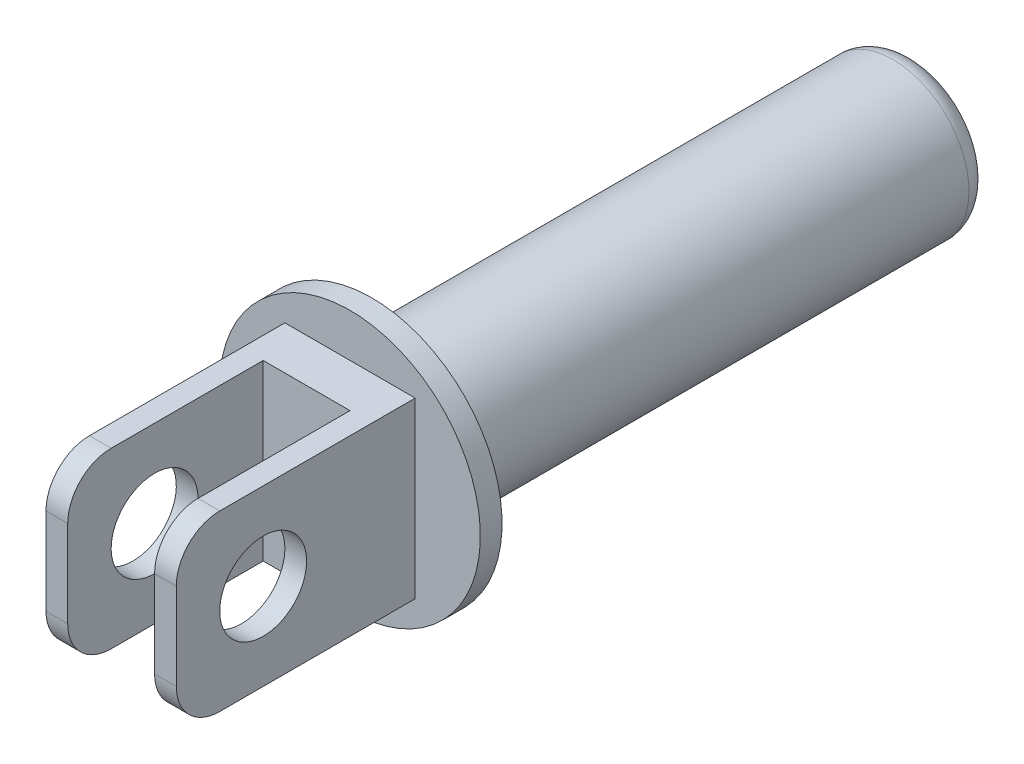
ISO-10303-21;
HEADER;
FILE_DESCRIPTION(('STEP AP214'),'2;1');
FILE_NAME('part.step','',(''),(''),'','','');
FILE_SCHEMA(('AUTOMOTIVE_DESIGN { 1 0 10303 214 1 1 1 1 }'));
ENDSEC;
DATA;
#1=APPLICATION_CONTEXT('core data for automotive mechanical design processes');
#2=APPLICATION_PROTOCOL_DEFINITION('international standard','automotive_design',2000,#1);
#3=PRODUCT_CONTEXT('',#1,'mechanical');
#4=PRODUCT('Part','Part','',(#3));
#5=PRODUCT_RELATED_PRODUCT_CATEGORY('part','',(#4));
#6=PRODUCT_DEFINITION_FORMATION('','',#4);
#7=PRODUCT_DEFINITION_CONTEXT('part definition',#1,'design');
#8=PRODUCT_DEFINITION('design','',#6,#7);
#9=PRODUCT_DEFINITION_SHAPE('','',#8);
#10=(LENGTH_UNIT() NAMED_UNIT(*) SI_UNIT(.MILLI.,.METRE.));
#11=(NAMED_UNIT(*) PLANE_ANGLE_UNIT() SI_UNIT($,.RADIAN.));
#12=(NAMED_UNIT(*) SI_UNIT($,.STERADIAN.) SOLID_ANGLE_UNIT());
#13=UNCERTAINTY_MEASURE_WITH_UNIT(LENGTH_MEASURE(1.E-05),#10,'distance_accuracy_value','');
#14=(GEOMETRIC_REPRESENTATION_CONTEXT(3) GLOBAL_UNCERTAINTY_ASSIGNED_CONTEXT((#13)) GLOBAL_UNIT_ASSIGNED_CONTEXT((#10,
#11,#12)) REPRESENTATION_CONTEXT('',''));
#15=CARTESIAN_POINT('',(0.,0.,0.));
#16=DIRECTION('',(0.,0.,1.));
#17=DIRECTION('',(1.,0.,0.));
#18=AXIS2_PLACEMENT_3D('',#15,#16,#17);
#19=CARTESIAN_POINT('',(0.,0.,30.));
#20=DIRECTION('',(0.,0.,1.));
#21=DIRECTION('',(-1.,0.,0.));
#22=AXIS2_PLACEMENT_3D('',#19,#20,#21);
#23=PLANE('',#22);
#24=DIRECTION('',(0.,1.,0.));
#25=VECTOR('',#24,1.);
#26=CARTESIAN_POINT('',(-7.5,10.,30.));
#27=LINE('',#26,#25);
#28=CARTESIAN_POINT('',(-7.5,-5.,30.));
#29=VERTEX_POINT('',#28);
#30=CARTESIAN_POINT('',(-7.5,5.,30.));
#31=VERTEX_POINT('',#30);
#32=EDGE_CURVE('E178',#29,#31,#27,.T.);
#33=ORIENTED_EDGE('',*,*,#32,.F.);
#34=DIRECTION('',(-1.,0.,0.));
#35=VECTOR('',#34,1.);
#36=CARTESIAN_POINT('',(-7.5,-5.,30.));
#37=LINE('',#36,#35);
#38=CARTESIAN_POINT('',(-5.,-5.,30.));
#39=VERTEX_POINT('',#38);
#40=EDGE_CURVE('E246',#39,#29,#37,.T.);
#41=ORIENTED_EDGE('',*,*,#40,.F.);
#42=DIRECTION('',(0.,1.,0.));
#43=VECTOR('',#42,1.);
#44=CARTESIAN_POINT('',(-5.,-10.,30.));
#45=LINE('',#44,#43);
#46=CARTESIAN_POINT('',(-5.,5.,30.));
#47=VERTEX_POINT('',#46);
#48=EDGE_CURVE('E153',#39,#47,#45,.T.);
#49=ORIENTED_EDGE('',*,*,#48,.T.);
#50=DIRECTION('',(1.,0.,0.));
#51=VECTOR('',#50,1.);
#52=CARTESIAN_POINT('',(-5.,5.,30.));
#53=LINE('',#52,#51);
#54=EDGE_CURVE('E248',#31,#47,#53,.T.);
#55=ORIENTED_EDGE('',*,*,#54,.F.);
#56=EDGE_LOOP('',(#33,#41,#49,#55));
#57=FACE_BOUND('',#56,.T.);
#58=ADVANCED_FACE('F37',(#57),#23,.T.);
#59=CARTESIAN_POINT('',(0.,0.,2.5));
#60=DIRECTION('',(0.,0.,1.));
#61=DIRECTION('',(-1.,0.,0.));
#62=AXIS2_PLACEMENT_3D('',#59,#60,#61);
#63=PLANE('',#62);
#64=CARTESIAN_POINT('',(0.,0.,2.5));
#65=DIRECTION('',(0.,0.,-1.));
#66=DIRECTION('',(-1.,0.,0.));
#67=AXIS2_PLACEMENT_3D('',#64,#65,#66);
#68=CIRCLE('',#67,15.);
#69=CARTESIAN_POINT('',(-15.,0.,2.5));
#70=VERTEX_POINT('',#69);
#71=EDGE_CURVE('E203',#70,#70,#68,.T.);
#72=ORIENTED_EDGE('',*,*,#71,.F.);
#73=EDGE_LOOP('',(#72));
#74=FACE_BOUND('',#73,.T.);
#75=DIRECTION('',(1.,0.,0.));
#76=VECTOR('',#75,1.);
#77=CARTESIAN_POINT('',(7.5,10.,2.5));
#78=LINE('',#77,#76);
#79=CARTESIAN_POINT('',(-7.5,10.,2.5));
#80=VERTEX_POINT('',#79);
#81=CARTESIAN_POINT('',(7.5,10.,2.5));
#82=VERTEX_POINT('',#81);
#83=EDGE_CURVE('E187',#80,#82,#78,.T.);
#84=ORIENTED_EDGE('',*,*,#83,.T.);
#85=DIRECTION('',(0.,-1.,0.));
#86=VECTOR('',#85,1.);
#87=CARTESIAN_POINT('',(7.5,10.,2.5));
#88=LINE('',#87,#86);
#89=CARTESIAN_POINT('',(7.5,-10.,2.5));
#90=VERTEX_POINT('',#89);
#91=EDGE_CURVE('E190',#82,#90,#88,.T.);
#92=ORIENTED_EDGE('',*,*,#91,.T.);
#93=DIRECTION('',(-1.,0.,0.));
#94=VECTOR('',#93,1.);
#95=CARTESIAN_POINT('',(7.5,-10.,2.5));
#96=LINE('',#95,#94);
#97=CARTESIAN_POINT('',(-7.5,-10.,2.5));
#98=VERTEX_POINT('',#97);
#99=EDGE_CURVE('E181',#90,#98,#96,.T.);
#100=ORIENTED_EDGE('',*,*,#99,.T.);
#101=DIRECTION('',(0.,1.,0.));
#102=VECTOR('',#101,1.);
#103=CARTESIAN_POINT('',(-7.5,10.,2.5));
#104=LINE('',#103,#102);
#105=EDGE_CURVE('E175',#98,#80,#104,.T.);
#106=ORIENTED_EDGE('',*,*,#105,.T.);
#107=EDGE_LOOP('',(#84,#92,#100,#106));
#108=FACE_BOUND('',#107,.T.);
#109=ADVANCED_FACE('F272',(#74,#108),#63,.T.);
#110=CARTESIAN_POINT('',(0.,0.,-62.5));
#111=DIRECTION('',(0.,0.,1.));
#112=DIRECTION('',(-1.,0.,0.));
#113=AXIS2_PLACEMENT_3D('',#110,#111,#112);
#114=CYLINDRICAL_SURFACE('',#113,8.75);
#115=CARTESIAN_POINT('',(0.,0.,-60.));
#116=DIRECTION('',(0.,0.,1.));
#117=DIRECTION('',(1.,0.,0.));
#118=AXIS2_PLACEMENT_3D('',#115,#116,#117);
#119=CIRCLE('',#118,8.75);
#120=CARTESIAN_POINT('',(8.75,0.,-60.));
#121=VERTEX_POINT('',#120);
#122=EDGE_CURVE('E221',#121,#121,#119,.F.);
#123=ORIENTED_EDGE('',*,*,#122,.F.);
#124=EDGE_LOOP('',(#123));
#125=FACE_BOUND('',#124,.T.);
#126=CARTESIAN_POINT('',(0.,0.,-2.5));
#127=DIRECTION('',(0.,0.,-1.));
#128=DIRECTION('',(-1.,0.,0.));
#129=AXIS2_PLACEMENT_3D('',#126,#127,#128);
#130=CIRCLE('',#129,8.75);
#131=CARTESIAN_POINT('',(-8.75,0.,-2.5));
#132=VERTEX_POINT('',#131);
#133=EDGE_CURVE('E215',#132,#132,#130,.F.);
#134=ORIENTED_EDGE('',*,*,#133,.F.);
#135=EDGE_LOOP('',(#134));
#136=FACE_BOUND('',#135,.T.);
#137=ADVANCED_FACE('F300',(#125,#136),#114,.T.);
#138=CARTESIAN_POINT('',(0.,0.,-62.5));
#139=DIRECTION('',(0.,0.,-1.));
#140=DIRECTION('',(1.,0.,0.));
#141=AXIS2_PLACEMENT_3D('',#138,#139,#140);
#142=PLANE('',#141);
#143=CARTESIAN_POINT('',(0.,0.,-62.5));
#144=DIRECTION('',(0.,0.,1.));
#145=DIRECTION('',(1.,0.,0.));
#146=AXIS2_PLACEMENT_3D('',#143,#144,#145);
#147=CIRCLE('',#146,6.25);
#148=CARTESIAN_POINT('',(6.25,0.,-62.5));
#149=VERTEX_POINT('',#148);
#150=EDGE_CURVE('E218',#149,#149,#147,.T.);
#151=ORIENTED_EDGE('',*,*,#150,.F.);
#152=EDGE_LOOP('',(#151));
#153=FACE_BOUND('',#152,.T.);
#154=CARTESIAN_POINT('',(0.,0.,-62.5));
#155=DIRECTION('',(0.,0.,1.));
#156=DIRECTION('',(1.,0.,0.));
#157=AXIS2_PLACEMENT_3D('',#154,#155,#156);
#158=CIRCLE('',#157,3.75);
#159=CARTESIAN_POINT('',(3.75,0.,-62.5));
#160=VERTEX_POINT('',#159);
#161=EDGE_CURVE('E167',#160,#160,#158,.T.);
#162=ORIENTED_EDGE('',*,*,#161,.T.);
#163=EDGE_LOOP('',(#162));
#164=FACE_BOUND('',#163,.T.);
#165=ADVANCED_FACE('F328',(#153,#164),#142,.T.);
#166=CARTESIAN_POINT('',(0.,0.,0.));
#167=DIRECTION('',(0.,0.,1.));
#168=DIRECTION('',(-1.,0.,0.));
#169=AXIS2_PLACEMENT_3D('',#166,#167,#168);
#170=PLANE('',#169);
#171=CARTESIAN_POINT('',(0.,0.,0.));
#172=DIRECTION('',(0.,0.,-1.));
#173=DIRECTION('',(-1.,0.,0.));
#174=AXIS2_PLACEMENT_3D('',#171,#172,#173);
#175=CIRCLE('',#174,11.25);
#176=CARTESIAN_POINT('',(-11.25,0.,0.));
#177=VERTEX_POINT('',#176);
#178=EDGE_CURVE('E206',#177,#177,#175,.T.);
#179=ORIENTED_EDGE('',*,*,#178,.F.);
#180=EDGE_LOOP('',(#179));
#181=FACE_BOUND('',#180,.T.);
#182=CARTESIAN_POINT('',(0.,0.,0.));
#183=DIRECTION('',(0.,0.,-1.));
#184=DIRECTION('',(-1.,0.,0.));
#185=AXIS2_PLACEMENT_3D('',#182,#183,#184);
#186=CIRCLE('',#185,15.);
#187=CARTESIAN_POINT('',(-15.,0.,0.));
#188=VERTEX_POINT('',#187);
#189=EDGE_CURVE('E202',#188,#188,#186,.T.);
#190=ORIENTED_EDGE('',*,*,#189,.T.);
#191=EDGE_LOOP('',(#190));
#192=FACE_BOUND('',#191,.T.);
#193=ADVANCED_FACE('F325',(#181,#192),#170,.F.);
#194=CARTESIAN_POINT('',(0.,0.,2.5));
#195=DIRECTION('',(0.,0.,-1.));
#196=DIRECTION('',(1.,0.,0.));
#197=AXIS2_PLACEMENT_3D('',#194,#195,#196);
#198=CYLINDRICAL_SURFACE('',#197,15.);
#199=ORIENTED_EDGE('',*,*,#71,.T.);
#200=EDGE_LOOP('',(#199));
#201=FACE_BOUND('',#200,.T.);
#202=ORIENTED_EDGE('',*,*,#189,.F.);
#203=EDGE_LOOP('',(#202));
#204=FACE_BOUND('',#203,.T.);
#205=ADVANCED_FACE('F322',(#201,#204),#198,.T.);
#206=CARTESIAN_POINT('',(-7.5,10.,30.));
#207=DIRECTION('',(1.,0.,0.));
#208=DIRECTION('',(0.,1.,0.));
#209=AXIS2_PLACEMENT_3D('',#206,#207,#208);
#210=PLANE('',#209);
#211=CARTESIAN_POINT('',(-7.5,0.,20.));
#212=DIRECTION('',(-1.,0.,0.));
#213=DIRECTION('',(0.,1.,0.));
#214=AXIS2_PLACEMENT_3D('',#211,#212,#213);
#215=CIRCLE('',#214,5.);
#216=CARTESIAN_POINT('',(-7.5,5.,20.));
#217=VERTEX_POINT('',#216);
#218=EDGE_CURVE('E159',#217,#217,#215,.T.);
#219=ORIENTED_EDGE('',*,*,#218,.F.);
#220=EDGE_LOOP('',(#219));
#221=FACE_BOUND('',#220,.T.);
#222=DIRECTION('',(0.,0.,-1.));
#223=VECTOR('',#222,1.);
#224=CARTESIAN_POINT('',(-7.5,10.,30.));
#225=LINE('',#224,#223);
#226=CARTESIAN_POINT('',(-7.5,10.,25.));
#227=VERTEX_POINT('',#226);
#228=EDGE_CURVE('E200',#227,#80,#225,.T.);
#229=ORIENTED_EDGE('',*,*,#228,.T.);
#230=ORIENTED_EDGE('',*,*,#105,.F.);
#231=DIRECTION('',(0.,0.,-1.));
#232=VECTOR('',#231,1.);
#233=CARTESIAN_POINT('',(-7.5,-10.,30.));
#234=LINE('',#233,#232);
#235=CARTESIAN_POINT('',(-7.5,-10.,25.));
#236=VERTEX_POINT('',#235);
#237=EDGE_CURVE('E184',#236,#98,#234,.T.);
#238=ORIENTED_EDGE('',*,*,#237,.F.);
#239=CARTESIAN_POINT('',(-7.5,-5.,25.));
#240=DIRECTION('',(-1.,0.,0.));
#241=DIRECTION('',(0.,1.,0.));
#242=AXIS2_PLACEMENT_3D('',#239,#240,#241);
#243=CIRCLE('',#242,5.);
#244=EDGE_CURVE('E45',#29,#236,#243,.F.);
#245=ORIENTED_EDGE('',*,*,#244,.F.);
#246=ORIENTED_EDGE('',*,*,#32,.T.);
#247=CARTESIAN_POINT('',(-7.5,5.,25.));
#248=DIRECTION('',(-1.,0.,0.));
#249=DIRECTION('',(0.,1.,0.));
#250=AXIS2_PLACEMENT_3D('',#247,#248,#249);
#251=CIRCLE('',#250,5.);
#252=EDGE_CURVE('E11',#227,#31,#251,.F.);
#253=ORIENTED_EDGE('',*,*,#252,.F.);
#254=EDGE_LOOP('',(#229,#230,#238,#245,#246,#253));
#255=FACE_BOUND('',#254,.T.);
#256=ADVANCED_FACE('F257',(#221,#255),#210,.F.);
#257=CARTESIAN_POINT('',(7.5,10.,30.));
#258=DIRECTION('',(0.,-1.,0.));
#259=DIRECTION('',(0.,0.,1.));
#260=AXIS2_PLACEMENT_3D('',#257,#258,#259);
#261=PLANE('',#260);
#262=DIRECTION('',(0.,0.,-1.));
#263=VECTOR('',#262,1.);
#264=CARTESIAN_POINT('',(7.5,10.,30.));
#265=LINE('',#264,#263);
#266=CARTESIAN_POINT('',(7.5,10.,25.));
#267=VERTEX_POINT('',#266);
#268=EDGE_CURVE('E198',#267,#82,#265,.T.);
#269=ORIENTED_EDGE('',*,*,#268,.T.);
#270=ORIENTED_EDGE('',*,*,#83,.F.);
#271=ORIENTED_EDGE('',*,*,#228,.F.);
#272=DIRECTION('',(1.,0.,0.));
#273=VECTOR('',#272,1.);
#274=CARTESIAN_POINT('',(-7.5,10.,25.));
#275=LINE('',#274,#273);
#276=CARTESIAN_POINT('',(-5.,10.,25.));
#277=VERTEX_POINT('',#276);
#278=EDGE_CURVE('E242',#277,#227,#275,.F.);
#279=ORIENTED_EDGE('',*,*,#278,.F.);
#280=DIRECTION('',(0.,0.,1.));
#281=VECTOR('',#280,1.);
#282=CARTESIAN_POINT('',(-5.,10.,7.5));
#283=LINE('',#282,#281);
#284=CARTESIAN_POINT('',(-5.,10.,7.5));
#285=VERTEX_POINT('',#284);
#286=EDGE_CURVE('E152',#285,#277,#283,.T.);
#287=ORIENTED_EDGE('',*,*,#286,.F.);
#288=DIRECTION('',(1.,0.,0.));
#289=VECTOR('',#288,1.);
#290=CARTESIAN_POINT('',(-5.,10.,7.5));
#291=LINE('',#290,#289);
#292=CARTESIAN_POINT('',(5.,10.,7.5));
#293=VERTEX_POINT('',#292);
#294=EDGE_CURVE('E130',#285,#293,#291,.T.);
#295=ORIENTED_EDGE('',*,*,#294,.T.);
#296=DIRECTION('',(0.,0.,1.));
#297=VECTOR('',#296,1.);
#298=CARTESIAN_POINT('',(5.,10.,7.5));
#299=LINE('',#298,#297);
#300=CARTESIAN_POINT('',(5.,10.,25.));
#301=VERTEX_POINT('',#300);
#302=EDGE_CURVE('E139',#293,#301,#299,.T.);
#303=ORIENTED_EDGE('',*,*,#302,.T.);
#304=DIRECTION('',(1.,0.,0.));
#305=VECTOR('',#304,1.);
#306=CARTESIAN_POINT('',(5.,10.,25.));
#307=LINE('',#306,#305);
#308=EDGE_CURVE('E244',#267,#301,#307,.F.);
#309=ORIENTED_EDGE('',*,*,#308,.F.);
#310=EDGE_LOOP('',(#269,#270,#271,#279,#287,#295,#303,#309));
#311=FACE_BOUND('',#310,.T.);
#312=ADVANCED_FACE('F149',(#311),#261,.F.);
#313=CARTESIAN_POINT('',(7.5,10.,30.));
#314=DIRECTION('',(-1.,0.,0.));
#315=DIRECTION('',(0.,-1.,0.));
#316=AXIS2_PLACEMENT_3D('',#313,#314,#315);
#317=PLANE('',#316);
#318=CARTESIAN_POINT('',(7.5,0.,20.));
#319=DIRECTION('',(1.,0.,0.));
#320=DIRECTION('',(0.,-1.,0.));
#321=AXIS2_PLACEMENT_3D('',#318,#319,#320);
#322=CIRCLE('',#321,5.);
#323=CARTESIAN_POINT('',(7.5,5.,20.));
#324=VERTEX_POINT('',#323);
#325=EDGE_CURVE('E509',#324,#324,#322,.T.);
#326=ORIENTED_EDGE('',*,*,#325,.F.);
#327=EDGE_LOOP('',(#326));
#328=FACE_BOUND('',#327,.T.);
#329=DIRECTION('',(0.,0.,-1.));
#330=VECTOR('',#329,1.);
#331=CARTESIAN_POINT('',(7.5,-10.,30.));
#332=LINE('',#331,#330);
#333=CARTESIAN_POINT('',(7.5,-10.,25.));
#334=VERTEX_POINT('',#333);
#335=EDGE_CURVE('E196',#334,#90,#332,.T.);
#336=ORIENTED_EDGE('',*,*,#335,.T.);
#337=ORIENTED_EDGE('',*,*,#91,.F.);
#338=ORIENTED_EDGE('',*,*,#268,.F.);
#339=CARTESIAN_POINT('',(7.5,5.,25.));
#340=DIRECTION('',(1.,0.,0.));
#341=DIRECTION('',(0.,-1.,0.));
#342=AXIS2_PLACEMENT_3D('',#339,#340,#341);
#343=CIRCLE('',#342,5.);
#344=CARTESIAN_POINT('',(7.5,5.,30.));
#345=VERTEX_POINT('',#344);
#346=EDGE_CURVE('E237',#345,#267,#343,.F.);
#347=ORIENTED_EDGE('',*,*,#346,.F.);
#348=DIRECTION('',(0.,-1.,0.));
#349=VECTOR('',#348,1.);
#350=CARTESIAN_POINT('',(7.5,10.,30.));
#351=LINE('',#350,#349);
#352=CARTESIAN_POINT('',(7.5,-5.,30.));
#353=VERTEX_POINT('',#352);
#354=EDGE_CURVE('E180',#345,#353,#351,.T.);
#355=ORIENTED_EDGE('',*,*,#354,.T.);
#356=CARTESIAN_POINT('',(7.5,-5.,25.));
#357=DIRECTION('',(1.,0.,0.));
#358=DIRECTION('',(0.,-1.,0.));
#359=AXIS2_PLACEMENT_3D('',#356,#357,#358);
#360=CIRCLE('',#359,5.);
#361=EDGE_CURVE('E239',#334,#353,#360,.F.);
#362=ORIENTED_EDGE('',*,*,#361,.F.);
#363=EDGE_LOOP('',(#336,#337,#338,#347,#355,#362));
#364=FACE_BOUND('',#363,.T.);
#365=ADVANCED_FACE('F274',(#328,#364),#317,.F.);
#366=CARTESIAN_POINT('',(7.5,-10.,30.));
#367=DIRECTION('',(0.,1.,0.));
#368=DIRECTION('',(0.,0.,-1.));
#369=AXIS2_PLACEMENT_3D('',#366,#367,#368);
#370=PLANE('',#369);
#371=DIRECTION('',(0.,0.,1.));
#372=VECTOR('',#371,1.);
#373=CARTESIAN_POINT('',(5.,-10.,7.5));
#374=LINE('',#373,#372);
#375=CARTESIAN_POINT('',(5.,-10.,7.5));
#376=VERTEX_POINT('',#375);
#377=CARTESIAN_POINT('',(5.,-10.,25.));
#378=VERTEX_POINT('',#377);
#379=EDGE_CURVE('E146',#376,#378,#374,.T.);
#380=ORIENTED_EDGE('',*,*,#379,.F.);
#381=DIRECTION('',(-1.,0.,0.));
#382=VECTOR('',#381,1.);
#383=CARTESIAN_POINT('',(5.,-10.,7.5));
#384=LINE('',#383,#382);
#385=CARTESIAN_POINT('',(-5.,-10.,7.5));
#386=VERTEX_POINT('',#385);
#387=EDGE_CURVE('E133',#376,#386,#384,.T.);
#388=ORIENTED_EDGE('',*,*,#387,.T.);
#389=DIRECTION('',(0.,0.,1.));
#390=VECTOR('',#389,1.);
#391=CARTESIAN_POINT('',(-5.,-10.,7.5));
#392=LINE('',#391,#390);
#393=CARTESIAN_POINT('',(-5.,-10.,25.));
#394=VERTEX_POINT('',#393);
#395=EDGE_CURVE('E168',#386,#394,#392,.T.);
#396=ORIENTED_EDGE('',*,*,#395,.T.);
#397=DIRECTION('',(-1.,0.,0.));
#398=VECTOR('',#397,1.);
#399=CARTESIAN_POINT('',(-5.,-10.,25.));
#400=LINE('',#399,#398);
#401=EDGE_CURVE('E232',#236,#394,#400,.F.);
#402=ORIENTED_EDGE('',*,*,#401,.F.);
#403=ORIENTED_EDGE('',*,*,#237,.T.);
#404=ORIENTED_EDGE('',*,*,#99,.F.);
#405=ORIENTED_EDGE('',*,*,#335,.F.);
#406=DIRECTION('',(-1.,0.,0.));
#407=VECTOR('',#406,1.);
#408=CARTESIAN_POINT('',(7.5,-10.,25.));
#409=LINE('',#408,#407);
#410=EDGE_CURVE('E235',#378,#334,#409,.F.);
#411=ORIENTED_EDGE('',*,*,#410,.F.);
#412=EDGE_LOOP('',(#380,#388,#396,#402,#403,#404,#405,#411));
#413=FACE_BOUND('',#412,.T.);
#414=ADVANCED_FACE('F260',(#413),#370,.F.);
#415=ORIENTED_EDGE('',*,*,#354,.F.);
#416=DIRECTION('',(1.,0.,0.));
#417=VECTOR('',#416,1.);
#418=CARTESIAN_POINT('',(7.5,5.,30.));
#419=LINE('',#418,#417);
#420=CARTESIAN_POINT('',(5.,5.,30.));
#421=VERTEX_POINT('',#420);
#422=EDGE_CURVE('E224',#421,#345,#419,.T.);
#423=ORIENTED_EDGE('',*,*,#422,.F.);
#424=DIRECTION('',(0.,-1.,0.));
#425=VECTOR('',#424,1.);
#426=CARTESIAN_POINT('',(5.,10.,30.));
#427=LINE('',#426,#425);
#428=CARTESIAN_POINT('',(5.,-5.,30.));
#429=VERTEX_POINT('',#428);
#430=EDGE_CURVE('E156',#421,#429,#427,.T.);
#431=ORIENTED_EDGE('',*,*,#430,.T.);
#432=DIRECTION('',(-1.,0.,0.));
#433=VECTOR('',#432,1.);
#434=CARTESIAN_POINT('',(5.,-5.,30.));
#435=LINE('',#434,#433);
#436=EDGE_CURVE('E226',#353,#429,#435,.T.);
#437=ORIENTED_EDGE('',*,*,#436,.F.);
#438=EDGE_LOOP('',(#415,#423,#431,#437));
#439=FACE_BOUND('',#438,.T.);
#440=ADVANCED_FACE('F283',(#439),#23,.T.);
#441=CARTESIAN_POINT('',(0.,0.,-27.5));
#442=DIRECTION('',(0.,0.,-1.));
#443=DIRECTION('',(1.,0.,0.));
#444=AXIS2_PLACEMENT_3D('',#441,#442,#443);
#445=CYLINDRICAL_SURFACE('',#444,3.75);
#446=CARTESIAN_POINT('',(0.,0.,-27.5));
#447=DIRECTION('',(0.,0.,1.));
#448=DIRECTION('',(1.,0.,0.));
#449=AXIS2_PLACEMENT_3D('',#446,#447,#448);
#450=CIRCLE('',#449,3.75);
#451=CARTESIAN_POINT('',(3.75,0.,-27.5));
#452=VERTEX_POINT('',#451);
#453=EDGE_CURVE('E172',#452,#452,#450,.T.);
#454=ORIENTED_EDGE('',*,*,#453,.T.);
#455=EDGE_LOOP('',(#454));
#456=FACE_BOUND('',#455,.T.);
#457=ORIENTED_EDGE('',*,*,#161,.F.);
#458=EDGE_LOOP('',(#457));
#459=FACE_BOUND('',#458,.T.);
#460=ADVANCED_FACE('F306',(#456,#459),#445,.F.);
#461=CARTESIAN_POINT('',(0.,0.,-27.5));
#462=DIRECTION('',(0.,0.,-1.));
#463=DIRECTION('',(1.,0.,0.));
#464=AXIS2_PLACEMENT_3D('',#461,#462,#463);
#465=PLANE('',#464);
#466=ORIENTED_EDGE('',*,*,#453,.F.);
#467=EDGE_LOOP('',(#466));
#468=FACE_BOUND('',#467,.T.);
#469=ADVANCED_FACE('F311',(#468),#465,.T.);
#470=CARTESIAN_POINT('',(-5.,-10.,7.5));
#471=DIRECTION('',(-1.,0.,0.));
#472=DIRECTION('',(0.,0.,-1.));
#473=AXIS2_PLACEMENT_3D('',#470,#471,#472);
#474=PLANE('',#473);
#475=CARTESIAN_POINT('',(-5.,0.,20.));
#476=DIRECTION('',(1.,0.,0.));
#477=DIRECTION('',(0.,0.,-1.));
#478=AXIS2_PLACEMENT_3D('',#475,#476,#477);
#479=CIRCLE('',#478,5.);
#480=CARTESIAN_POINT('',(-5.,5.,20.));
#481=VERTEX_POINT('',#480);
#482=EDGE_CURVE('E212',#481,#481,#479,.T.);
#483=ORIENTED_EDGE('',*,*,#482,.F.);
#484=EDGE_LOOP('',(#483));
#485=FACE_BOUND('',#484,.T.);
#486=ORIENTED_EDGE('',*,*,#48,.F.);
#487=CARTESIAN_POINT('',(-5.,-5.,25.));
#488=DIRECTION('',(1.,0.,0.));
#489=DIRECTION('',(0.,0.,-1.));
#490=AXIS2_PLACEMENT_3D('',#487,#488,#489);
#491=CIRCLE('',#490,5.);
#492=EDGE_CURVE('E250',#394,#39,#491,.F.);
#493=ORIENTED_EDGE('',*,*,#492,.F.);
#494=ORIENTED_EDGE('',*,*,#395,.F.);
#495=DIRECTION('',(0.,1.,0.));
#496=VECTOR('',#495,1.);
#497=CARTESIAN_POINT('',(-5.,-10.,7.5));
#498=LINE('',#497,#496);
#499=EDGE_CURVE('E147',#386,#285,#498,.T.);
#500=ORIENTED_EDGE('',*,*,#499,.T.);
#501=ORIENTED_EDGE('',*,*,#286,.T.);
#502=CARTESIAN_POINT('',(-5.,5.,25.));
#503=DIRECTION('',(1.,0.,0.));
#504=DIRECTION('',(0.,0.,-1.));
#505=AXIS2_PLACEMENT_3D('',#502,#503,#504);
#506=CIRCLE('',#505,5.);
#507=EDGE_CURVE('E252',#47,#277,#506,.F.);
#508=ORIENTED_EDGE('',*,*,#507,.F.);
#509=EDGE_LOOP('',(#486,#493,#494,#500,#501,#508));
#510=FACE_BOUND('',#509,.T.);
#511=ADVANCED_FACE('F265',(#485,#510),#474,.F.);
#512=CARTESIAN_POINT('',(5.,10.,7.5));
#513=DIRECTION('',(1.,0.,0.));
#514=DIRECTION('',(0.,1.,0.));
#515=AXIS2_PLACEMENT_3D('',#512,#513,#514);
#516=PLANE('',#515);
#517=CARTESIAN_POINT('',(5.,0.,20.));
#518=DIRECTION('',(-1.,0.,0.));
#519=DIRECTION('',(0.,1.,0.));
#520=AXIS2_PLACEMENT_3D('',#517,#518,#519);
#521=CIRCLE('',#520,5.);
#522=CARTESIAN_POINT('',(5.,5.,20.));
#523=VERTEX_POINT('',#522);
#524=EDGE_CURVE('E209',#523,#523,#521,.T.);
#525=ORIENTED_EDGE('',*,*,#524,.F.);
#526=EDGE_LOOP('',(#525));
#527=FACE_BOUND('',#526,.T.);
#528=ORIENTED_EDGE('',*,*,#430,.F.);
#529=CARTESIAN_POINT('',(5.,5.,25.));
#530=DIRECTION('',(-1.,0.,0.));
#531=DIRECTION('',(0.,1.,0.));
#532=AXIS2_PLACEMENT_3D('',#529,#530,#531);
#533=CIRCLE('',#532,5.);
#534=EDGE_CURVE('E142',#301,#421,#533,.F.);
#535=ORIENTED_EDGE('',*,*,#534,.F.);
#536=ORIENTED_EDGE('',*,*,#302,.F.);
#537=DIRECTION('',(0.,-1.,0.));
#538=VECTOR('',#537,1.);
#539=CARTESIAN_POINT('',(5.,10.,7.5));
#540=LINE('',#539,#538);
#541=EDGE_CURVE('E126',#293,#376,#540,.T.);
#542=ORIENTED_EDGE('',*,*,#541,.T.);
#543=ORIENTED_EDGE('',*,*,#379,.T.);
#544=CARTESIAN_POINT('',(5.,-5.,25.));
#545=DIRECTION('',(-1.,0.,0.));
#546=DIRECTION('',(0.,1.,0.));
#547=AXIS2_PLACEMENT_3D('',#544,#545,#546);
#548=CIRCLE('',#547,5.);
#549=EDGE_CURVE('E230',#429,#378,#548,.F.);
#550=ORIENTED_EDGE('',*,*,#549,.F.);
#551=EDGE_LOOP('',(#528,#535,#536,#542,#543,#550));
#552=FACE_BOUND('',#551,.T.);
#553=ADVANCED_FACE('F141',(#527,#552),#516,.F.);
#554=CARTESIAN_POINT('',(0.,0.,7.5));
#555=DIRECTION('',(0.,0.,1.));
#556=DIRECTION('',(-1.,0.,0.));
#557=AXIS2_PLACEMENT_3D('',#554,#555,#556);
#558=PLANE('',#557);
#559=ORIENTED_EDGE('',*,*,#294,.F.);
#560=ORIENTED_EDGE('',*,*,#499,.F.);
#561=ORIENTED_EDGE('',*,*,#387,.F.);
#562=ORIENTED_EDGE('',*,*,#541,.F.);
#563=EDGE_LOOP('',(#559,#560,#561,#562));
#564=FACE_BOUND('',#563,.T.);
#565=ADVANCED_FACE('F128',(#564),#558,.T.);
#566=CARTESIAN_POINT('',(-15.,0.,20.));
#567=DIRECTION('',(1.,0.,0.));
#568=DIRECTION('',(0.,1.,0.));
#569=AXIS2_PLACEMENT_3D('',#566,#567,#568);
#570=CYLINDRICAL_SURFACE('',#569,5.);
#571=CARTESIAN_POINT('',(5.,5.,20.));
#572=CARTESIAN_POINT('',(5.02604166666667,5.,20.));
#573=CARTESIAN_POINT('',(5.05208333333333,5.,20.));
#574=CARTESIAN_POINT('',(5.10416666666667,5.,20.));
#575=CARTESIAN_POINT('',(5.13020833333333,5.,20.));
#576=CARTESIAN_POINT('',(5.18229166666667,5.,20.));
#577=CARTESIAN_POINT('',(5.20833333333334,5.,20.));
#578=CARTESIAN_POINT('',(5.26041666666667,5.,20.));
#579=CARTESIAN_POINT('',(5.28645833333333,5.,20.));
#580=CARTESIAN_POINT('',(5.33854166666667,5.,20.));
#581=CARTESIAN_POINT('',(5.36458333333333,5.,20.));
#582=CARTESIAN_POINT('',(5.41666666666667,5.,20.));
#583=CARTESIAN_POINT('',(5.44270833333333,5.,20.));
#584=CARTESIAN_POINT('',(5.49479166666667,5.,20.));
#585=CARTESIAN_POINT('',(5.52083333333334,5.,20.));
#586=CARTESIAN_POINT('',(5.57291666666667,5.,20.));
#587=CARTESIAN_POINT('',(5.59895833333333,5.,20.));
#588=CARTESIAN_POINT('',(5.65104166666667,5.,20.));
#589=CARTESIAN_POINT('',(5.67708333333333,5.,20.));
#590=CARTESIAN_POINT('',(5.72916666666667,5.,20.));
#591=CARTESIAN_POINT('',(5.75520833333333,5.,20.));
#592=CARTESIAN_POINT('',(5.80729166666667,5.,20.));
#593=CARTESIAN_POINT('',(5.83333333333334,5.,20.));
#594=CARTESIAN_POINT('',(5.88541666666667,5.,20.));
#595=CARTESIAN_POINT('',(5.91145833333334,5.,20.));
#596=CARTESIAN_POINT('',(5.96354166666667,5.,20.));
#597=CARTESIAN_POINT('',(5.98958333333333,5.,20.));
#598=CARTESIAN_POINT('',(6.04166666666667,5.,20.));
#599=CARTESIAN_POINT('',(6.06770833333333,5.,20.));
#600=CARTESIAN_POINT('',(6.11979166666667,5.,20.));
#601=CARTESIAN_POINT('',(6.14583333333334,5.,20.));
#602=CARTESIAN_POINT('',(6.19791666666667,5.,20.));
#603=CARTESIAN_POINT('',(6.22395833333334,5.,20.));
#604=CARTESIAN_POINT('',(6.27604166666667,5.,20.));
#605=CARTESIAN_POINT('',(6.30208333333333,5.,20.));
#606=CARTESIAN_POINT('',(6.35416666666667,5.,20.));
#607=CARTESIAN_POINT('',(6.38020833333333,5.,20.));
#608=CARTESIAN_POINT('',(6.43229166666667,5.,20.));
#609=CARTESIAN_POINT('',(6.45833333333334,5.,20.));
#610=CARTESIAN_POINT('',(6.51041666666667,5.,20.));
#611=CARTESIAN_POINT('',(6.53645833333334,5.,20.));
#612=CARTESIAN_POINT('',(6.58854166666667,5.,20.));
#613=CARTESIAN_POINT('',(6.61458333333333,5.,20.));
#614=CARTESIAN_POINT('',(6.66666666666667,5.,20.));
#615=CARTESIAN_POINT('',(6.69270833333333,5.,20.));
#616=CARTESIAN_POINT('',(6.74479166666667,5.,20.));
#617=CARTESIAN_POINT('',(6.77083333333334,5.,20.));
#618=CARTESIAN_POINT('',(6.82291666666667,5.,20.));
#619=CARTESIAN_POINT('',(6.84895833333334,5.,20.));
#620=CARTESIAN_POINT('',(6.90104166666667,5.,20.));
#621=CARTESIAN_POINT('',(6.92708333333333,5.,20.));
#622=CARTESIAN_POINT('',(6.97916666666667,5.,20.));
#623=CARTESIAN_POINT('',(7.00520833333334,5.,20.));
#624=CARTESIAN_POINT('',(7.05729166666667,5.,20.));
#625=CARTESIAN_POINT('',(7.08333333333334,5.,20.));
#626=CARTESIAN_POINT('',(7.13541666666667,5.,20.));
#627=CARTESIAN_POINT('',(7.16145833333334,5.,20.));
#628=CARTESIAN_POINT('',(7.21354166666667,5.,20.));
#629=CARTESIAN_POINT('',(7.23958333333333,5.,20.));
#630=CARTESIAN_POINT('',(7.29166666666667,5.,20.));
#631=CARTESIAN_POINT('',(7.31770833333334,5.,20.));
#632=CARTESIAN_POINT('',(7.36979166666667,5.,20.));
#633=CARTESIAN_POINT('',(7.39583333333334,5.,20.));
#634=CARTESIAN_POINT('',(7.44791666666667,5.,20.));
#635=CARTESIAN_POINT('',(7.47395833333334,5.,20.));
#636=CARTESIAN_POINT('',(7.5,5.,20.));
#637=B_SPLINE_CURVE_WITH_KNOTS('',3,(#571,#572,#573,#574,#575,#576,#577,#578,#579,#580,#581,
#582,#583,#584,#585,#586,#587,#588,#589,#590,#591,#592,#593,#594,#595,#596,#597,#598,#599,#600,
#601,#602,#603,#604,#605,#606,#607,#608,#609,#610,#611,#612,#613,#614,#615,#616,#617,#618,#619,
#620,#621,#622,#623,#624,#625,#626,#627,#628,#629,#630,#631,#632,#633,#634,#635,#636),
.UNSPECIFIED.,.F.,.F.,(4,2,2,2,2,2,2,2,2,2,2,2,2,2,2,2,2,2,2,2,2,2,2,2,2,2,2,2,2,2,2,2,4),(0.,
0.0781249999999983,0.15625,0.234375000000002,0.3125,0.390624999999999,0.46875,0.546875000000002,
0.625000000000001,0.703124999999999,0.781250000000001,0.859375000000002,0.937500000000001,
1.015625,1.09375,1.171875,1.25,1.328125,1.40625,1.484375,1.5625,1.640625,1.71875,1.796875,1.875,
1.953125,2.03125,2.109375,2.1875,2.265625,2.34375,2.421875,2.5),.UNSPECIFIED.);
#638=EDGE_CURVE('BSEAM459',#523,#324,#637,.T.);
#639=ORIENTED_EDGE('',*,*,#524,.T.);
#640=ORIENTED_EDGE('',*,*,#325,.T.);
#641=ORIENTED_EDGE('',*,*,#638,.T.);
#642=ORIENTED_EDGE('',*,*,#638,.F.);
#643=EDGE_LOOP('',(#639,#641,#640,#642));
#644=FACE_BOUND('',#643,.T.);
#645=ADVANCED_FACE('F459',(#644),#570,.F.);
#646=CARTESIAN_POINT('',(-5.,5.,20.));
#647=CARTESIAN_POINT('',(-5.02604166666667,5.,20.));
#648=CARTESIAN_POINT('',(-5.05208333333334,5.,20.));
#649=CARTESIAN_POINT('',(-5.10416666666667,5.,20.));
#650=CARTESIAN_POINT('',(-5.13020833333334,5.,20.));
#651=CARTESIAN_POINT('',(-5.18229166666667,5.,20.));
#652=CARTESIAN_POINT('',(-5.20833333333334,5.,20.));
#653=CARTESIAN_POINT('',(-5.26041666666667,5.,20.));
#654=CARTESIAN_POINT('',(-5.28645833333334,5.,20.));
#655=CARTESIAN_POINT('',(-5.33854166666667,5.,20.));
#656=CARTESIAN_POINT('',(-5.36458333333334,5.,20.));
#657=CARTESIAN_POINT('',(-5.41666666666667,5.,20.));
#658=CARTESIAN_POINT('',(-5.44270833333333,5.,20.));
#659=CARTESIAN_POINT('',(-5.49479166666667,5.,20.));
#660=CARTESIAN_POINT('',(-5.52083333333333,5.,20.));
#661=CARTESIAN_POINT('',(-5.57291666666667,5.,20.));
#662=CARTESIAN_POINT('',(-5.59895833333333,5.,20.));
#663=CARTESIAN_POINT('',(-5.65104166666667,5.,20.));
#664=CARTESIAN_POINT('',(-5.67708333333333,5.,20.));
#665=CARTESIAN_POINT('',(-5.72916666666667,5.,20.));
#666=CARTESIAN_POINT('',(-5.75520833333334,5.,20.));
#667=CARTESIAN_POINT('',(-5.80729166666667,5.,20.));
#668=CARTESIAN_POINT('',(-5.83333333333334,5.,20.));
#669=CARTESIAN_POINT('',(-5.88541666666667,5.,20.));
#670=CARTESIAN_POINT('',(-5.91145833333334,5.,20.));
#671=CARTESIAN_POINT('',(-5.96354166666667,5.,20.));
#672=CARTESIAN_POINT('',(-5.98958333333334,5.,20.));
#673=CARTESIAN_POINT('',(-6.04166666666667,5.,20.));
#674=CARTESIAN_POINT('',(-6.06770833333334,5.,20.));
#675=CARTESIAN_POINT('',(-6.11979166666667,5.,20.));
#676=CARTESIAN_POINT('',(-6.14583333333334,5.,20.));
#677=CARTESIAN_POINT('',(-6.19791666666667,5.,20.));
#678=CARTESIAN_POINT('',(-6.22395833333333,5.,20.));
#679=CARTESIAN_POINT('',(-6.27604166666667,5.,20.));
#680=CARTESIAN_POINT('',(-6.30208333333333,5.,20.));
#681=CARTESIAN_POINT('',(-6.35416666666667,5.,20.));
#682=CARTESIAN_POINT('',(-6.38020833333333,5.,20.));
#683=CARTESIAN_POINT('',(-6.43229166666667,5.,20.));
#684=CARTESIAN_POINT('',(-6.45833333333333,5.,20.));
#685=CARTESIAN_POINT('',(-6.51041666666667,5.,20.));
#686=CARTESIAN_POINT('',(-6.53645833333333,5.,20.));
#687=CARTESIAN_POINT('',(-6.58854166666667,5.,20.));
#688=CARTESIAN_POINT('',(-6.61458333333333,5.,20.));
#689=CARTESIAN_POINT('',(-6.66666666666667,5.,20.));
#690=CARTESIAN_POINT('',(-6.69270833333333,5.,20.));
#691=CARTESIAN_POINT('',(-6.74479166666667,5.,20.));
#692=CARTESIAN_POINT('',(-6.77083333333333,5.,20.));
#693=CARTESIAN_POINT('',(-6.82291666666667,5.,20.));
#694=CARTESIAN_POINT('',(-6.84895833333333,5.,20.));
#695=CARTESIAN_POINT('',(-6.90104166666667,5.,20.));
#696=CARTESIAN_POINT('',(-6.92708333333333,5.,20.));
#697=CARTESIAN_POINT('',(-6.97916666666667,5.,20.));
#698=CARTESIAN_POINT('',(-7.00520833333333,5.,20.));
#699=CARTESIAN_POINT('',(-7.05729166666667,5.,20.));
#700=CARTESIAN_POINT('',(-7.08333333333333,5.,20.));
#701=CARTESIAN_POINT('',(-7.13541666666667,5.,20.));
#702=CARTESIAN_POINT('',(-7.16145833333333,5.,20.));
#703=CARTESIAN_POINT('',(-7.21354166666667,5.,20.));
#704=CARTESIAN_POINT('',(-7.23958333333333,5.,20.));
#705=CARTESIAN_POINT('',(-7.29166666666667,5.,20.));
#706=CARTESIAN_POINT('',(-7.31770833333333,5.,20.));
#707=CARTESIAN_POINT('',(-7.36979166666667,5.,20.));
#708=CARTESIAN_POINT('',(-7.39583333333333,5.,20.));
#709=CARTESIAN_POINT('',(-7.44791666666667,5.,20.));
#710=CARTESIAN_POINT('',(-7.47395833333333,5.,20.));
#711=CARTESIAN_POINT('',(-7.5,5.,20.));
#712=B_SPLINE_CURVE_WITH_KNOTS('',3,(#646,#647,#648,#649,#650,#651,#652,#653,#654,#655,#656,
#657,#658,#659,#660,#661,#662,#663,#664,#665,#666,#667,#668,#669,#670,#671,#672,#673,#674,#675,
#676,#677,#678,#679,#680,#681,#682,#683,#684,#685,#686,#687,#688,#689,#690,#691,#692,#693,#694,
#695,#696,#697,#698,#699,#700,#701,#702,#703,#704,#705,#706,#707,#708,#709,#710,#711),
.UNSPECIFIED.,.F.,.F.,(4,2,2,2,2,2,2,2,2,2,2,2,2,2,2,2,2,2,2,2,2,2,2,2,2,2,2,2,2,2,2,2,4),(0.,
0.0781250000000001,0.15625,0.234375,0.3125,0.390625,0.468749999999999,0.546874999999999,
0.624999999999999,0.703124999999999,0.781249999999999,0.859374999999999,0.937499999999999,
1.015625,1.09375,1.171875,1.25,1.328125,1.40625,1.484375,1.5625,1.640625,1.71875,1.796875,1.875,
1.953125,2.03125,2.109375,2.1875,2.265625,2.34375,2.421875,2.5),.UNSPECIFIED.);
#713=EDGE_CURVE('BSEAM342',#481,#217,#712,.T.);
#714=ORIENTED_EDGE('',*,*,#482,.T.);
#715=ORIENTED_EDGE('',*,*,#218,.T.);
#716=ORIENTED_EDGE('',*,*,#713,.T.);
#717=ORIENTED_EDGE('',*,*,#713,.F.);
#718=EDGE_LOOP('',(#714,#716,#715,#717));
#719=FACE_BOUND('',#718,.T.);
#720=ADVANCED_FACE('F342',(#719),#570,.F.);
#721=CARTESIAN_POINT('',(0.,0.,-2.5));
#722=DIRECTION('',(0.,0.,1.));
#723=DIRECTION('',(-1.,0.,0.));
#724=AXIS2_PLACEMENT_3D('',#721,#722,#723);
#725=TOROIDAL_SURFACE('',#724,11.25,2.5);
#726=ORIENTED_EDGE('',*,*,#133,.T.);
#727=EDGE_LOOP('',(#726));
#728=FACE_BOUND('',#727,.T.);
#729=ORIENTED_EDGE('',*,*,#178,.T.);
#730=EDGE_LOOP('',(#729));
#731=FACE_BOUND('',#730,.T.);
#732=ADVANCED_FACE('F339',(#728,#731),#725,.F.);
#733=CARTESIAN_POINT('',(0.,0.,-60.));
#734=DIRECTION('',(0.,0.,-1.));
#735=DIRECTION('',(1.,0.,0.));
#736=AXIS2_PLACEMENT_3D('',#733,#734,#735);
#737=TOROIDAL_SURFACE('',#736,6.25,2.5);
#738=ORIENTED_EDGE('',*,*,#122,.T.);
#739=EDGE_LOOP('',(#738));
#740=FACE_BOUND('',#739,.T.);
#741=ORIENTED_EDGE('',*,*,#150,.T.);
#742=EDGE_LOOP('',(#741));
#743=FACE_BOUND('',#742,.T.);
#744=ADVANCED_FACE('F293',(#740,#743),#737,.T.);
#745=CARTESIAN_POINT('',(0.,-5.,25.));
#746=DIRECTION('',(1.,0.,0.));
#747=DIRECTION('',(0.,0.,1.));
#748=AXIS2_PLACEMENT_3D('',#745,#746,#747);
#749=CYLINDRICAL_SURFACE('',#748,5.);
#750=ORIENTED_EDGE('',*,*,#361,.T.);
#751=ORIENTED_EDGE('',*,*,#436,.T.);
#752=ORIENTED_EDGE('',*,*,#549,.T.);
#753=ORIENTED_EDGE('',*,*,#410,.T.);
#754=EDGE_LOOP('',(#750,#751,#752,#753));
#755=FACE_BOUND('',#754,.T.);
#756=ADVANCED_FACE('F280',(#755),#749,.T.);
#757=CARTESIAN_POINT('',(0.,5.,25.));
#758=DIRECTION('',(-1.,0.,0.));
#759=DIRECTION('',(0.,0.,-1.));
#760=AXIS2_PLACEMENT_3D('',#757,#758,#759);
#761=CYLINDRICAL_SURFACE('',#760,5.);
#762=ORIENTED_EDGE('',*,*,#534,.T.);
#763=ORIENTED_EDGE('',*,*,#422,.T.);
#764=ORIENTED_EDGE('',*,*,#346,.T.);
#765=ORIENTED_EDGE('',*,*,#308,.T.);
#766=EDGE_LOOP('',(#762,#763,#764,#765));
#767=FACE_BOUND('',#766,.T.);
#768=ADVANCED_FACE('F285',(#767),#761,.T.);
#769=CARTESIAN_POINT('',(0.,5.,25.));
#770=DIRECTION('',(-1.,0.,0.));
#771=DIRECTION('',(0.,0.,-1.));
#772=AXIS2_PLACEMENT_3D('',#769,#770,#771);
#773=CYLINDRICAL_SURFACE('',#772,5.);
#774=ORIENTED_EDGE('',*,*,#252,.T.);
#775=ORIENTED_EDGE('',*,*,#54,.T.);
#776=ORIENTED_EDGE('',*,*,#507,.T.);
#777=ORIENTED_EDGE('',*,*,#278,.T.);
#778=EDGE_LOOP('',(#774,#775,#776,#777));
#779=FACE_BOUND('',#778,.T.);
#780=ADVANCED_FACE('F287',(#779),#773,.T.);
#781=CARTESIAN_POINT('',(0.,-5.,25.));
#782=DIRECTION('',(1.,0.,0.));
#783=DIRECTION('',(0.,0.,1.));
#784=AXIS2_PLACEMENT_3D('',#781,#782,#783);
#785=CYLINDRICAL_SURFACE('',#784,5.);
#786=ORIENTED_EDGE('',*,*,#492,.T.);
#787=ORIENTED_EDGE('',*,*,#40,.T.);
#788=ORIENTED_EDGE('',*,*,#244,.T.);
#789=ORIENTED_EDGE('',*,*,#401,.T.);
#790=EDGE_LOOP('',(#786,#787,#788,#789));
#791=FACE_BOUND('',#790,.T.);
#792=ADVANCED_FACE('F39',(#791),#785,.T.);
#793=CLOSED_SHELL('',(#58,#109,#137,#165,#193,#205,#256,#312,#365,#414,#440,#460,#469,#511,#553,
#565,#645,#720,#732,#744,#756,#768,#780,#792));
#794=MANIFOLD_SOLID_BREP('B2',#793);
#795=ADVANCED_BREP_SHAPE_REPRESENTATION('',(#18,#794),#14);
#796=SHAPE_DEFINITION_REPRESENTATION(#9,#795);
ENDSEC;
END-ISO-10303-21;
